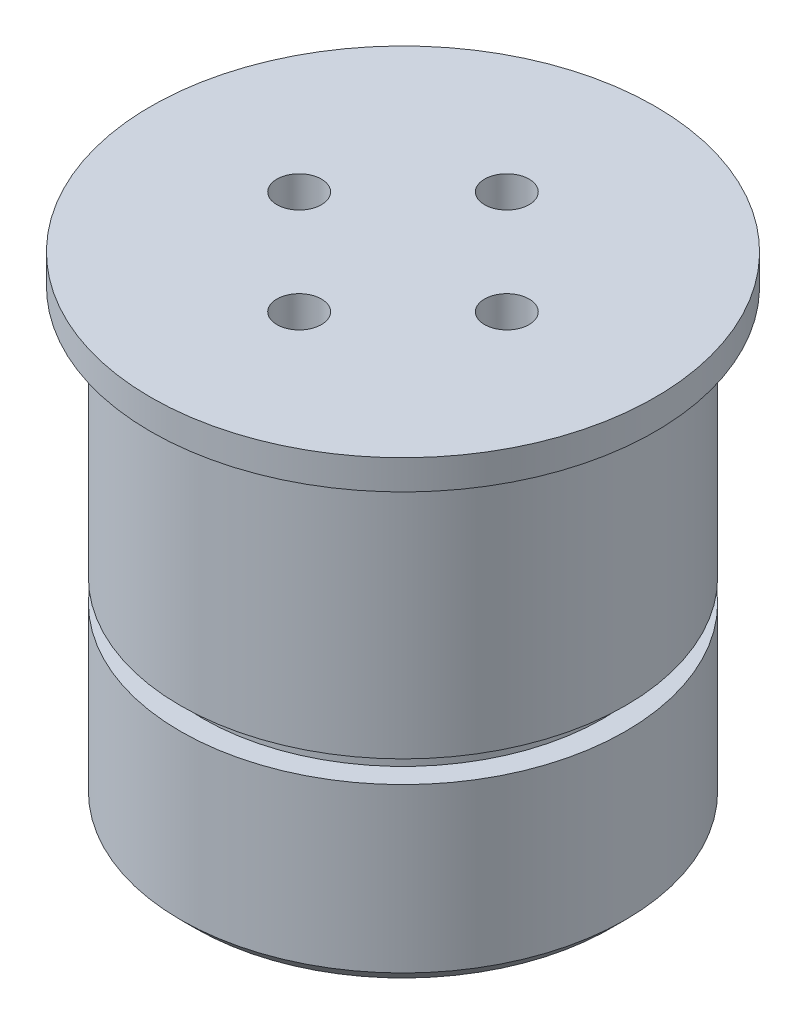
ISO-10303-21;
HEADER;
FILE_DESCRIPTION(('STEP AP214'),'2;1');
FILE_NAME('part.step','',(''),(''),'','','');
FILE_SCHEMA(('AUTOMOTIVE_DESIGN { 1 0 10303 214 1 1 1 1 }'));
ENDSEC;
DATA;
#1=APPLICATION_CONTEXT('core data for automotive mechanical design processes');
#2=APPLICATION_PROTOCOL_DEFINITION('international standard','automotive_design',2000,#1);
#3=PRODUCT_CONTEXT('',#1,'mechanical');
#4=PRODUCT('Part','Part','',(#3));
#5=PRODUCT_RELATED_PRODUCT_CATEGORY('part','',(#4));
#6=PRODUCT_DEFINITION_FORMATION('','',#4);
#7=PRODUCT_DEFINITION_CONTEXT('part definition',#1,'design');
#8=PRODUCT_DEFINITION('design','',#6,#7);
#9=PRODUCT_DEFINITION_SHAPE('','',#8);
#10=(LENGTH_UNIT() NAMED_UNIT(*) SI_UNIT(.MILLI.,.METRE.));
#11=(NAMED_UNIT(*) PLANE_ANGLE_UNIT() SI_UNIT($,.RADIAN.));
#12=(NAMED_UNIT(*) SI_UNIT($,.STERADIAN.) SOLID_ANGLE_UNIT());
#13=UNCERTAINTY_MEASURE_WITH_UNIT(LENGTH_MEASURE(1.E-05),#10,'distance_accuracy_value','');
#14=(GEOMETRIC_REPRESENTATION_CONTEXT(3) GLOBAL_UNCERTAINTY_ASSIGNED_CONTEXT((#13)) GLOBAL_UNIT_ASSIGNED_CONTEXT((#10,
#11,#12)) REPRESENTATION_CONTEXT('',''));
#15=CARTESIAN_POINT('',(0.,0.,0.));
#16=DIRECTION('',(0.,0.,1.));
#17=DIRECTION('',(1.,0.,0.));
#18=AXIS2_PLACEMENT_3D('',#15,#16,#17);
#19=CARTESIAN_POINT('',(0.,32.7031489839219,0.));
#20=DIRECTION('',(0.,1.,0.));
#21=DIRECTION('',(0.,0.,1.));
#22=AXIS2_PLACEMENT_3D('',#19,#20,#21);
#23=CYLINDRICAL_SURFACE('',#22,15.);
#24=CARTESIAN_POINT('',(0.,1.,0.));
#25=DIRECTION('',(0.,1.,0.));
#26=DIRECTION('',(0.,0.,1.));
#27=AXIS2_PLACEMENT_3D('',#24,#25,#26);
#28=CIRCLE('',#27,15.);
#29=CARTESIAN_POINT('',(0.,0.999999999999999,15.));
#30=VERTEX_POINT('',#29);
#31=EDGE_CURVE('E40',#30,#30,#28,.T.);
#32=ORIENTED_EDGE('',*,*,#31,.T.);
#33=EDGE_LOOP('',(#32));
#34=FACE_BOUND('',#33,.T.);
#35=CARTESIAN_POINT('',(0.,12.,0.));
#36=DIRECTION('',(0.,1.,0.));
#37=DIRECTION('',(0.,0.,1.));
#38=AXIS2_PLACEMENT_3D('',#35,#36,#37);
#39=CIRCLE('',#38,15.);
#40=CARTESIAN_POINT('',(0.,12.,15.));
#41=VERTEX_POINT('',#40);
#42=EDGE_CURVE('E44',#41,#41,#39,.T.);
#43=ORIENTED_EDGE('',*,*,#42,.F.);
#44=EDGE_LOOP('',(#43));
#45=FACE_BOUND('',#44,.T.);
#46=ADVANCED_FACE('F33',(#34,#45),#23,.T.);
#47=CARTESIAN_POINT('',(0.,12.,-15.));
#48=DIRECTION('',(0.,-1.,0.));
#49=DIRECTION('',(0.,0.,-1.));
#50=AXIS2_PLACEMENT_3D('',#47,#48,#49);
#51=PLANE('',#50);
#52=CARTESIAN_POINT('',(0.,12.,0.));
#53=DIRECTION('',(0.,1.,0.));
#54=DIRECTION('',(0.,0.,1.));
#55=AXIS2_PLACEMENT_3D('',#52,#53,#54);
#56=CIRCLE('',#55,13.5);
#57=CARTESIAN_POINT('',(0.,12.,13.5));
#58=VERTEX_POINT('',#57);
#59=EDGE_CURVE('E48',#58,#58,#56,.T.);
#60=ORIENTED_EDGE('',*,*,#59,.F.);
#61=EDGE_LOOP('',(#60));
#62=FACE_BOUND('',#61,.T.);
#63=ORIENTED_EDGE('',*,*,#42,.T.);
#64=EDGE_LOOP('',(#63));
#65=FACE_BOUND('',#64,.T.);
#66=ADVANCED_FACE('F125',(#62,#65),#51,.F.);
#67=CARTESIAN_POINT('',(0.,32.7031489839219,0.));
#68=DIRECTION('',(0.,1.,0.));
#69=DIRECTION('',(0.,0.,1.));
#70=AXIS2_PLACEMENT_3D('',#67,#68,#69);
#71=CYLINDRICAL_SURFACE('',#70,13.5);
#72=CARTESIAN_POINT('',(0.,13.5,0.));
#73=DIRECTION('',(0.,1.,0.));
#74=DIRECTION('',(0.,0.,1.));
#75=AXIS2_PLACEMENT_3D('',#72,#73,#74);
#76=CIRCLE('',#75,13.5);
#77=CARTESIAN_POINT('',(0.,13.5,13.5));
#78=VERTEX_POINT('',#77);
#79=EDGE_CURVE('E53',#78,#78,#76,.T.);
#80=ORIENTED_EDGE('',*,*,#79,.F.);
#81=EDGE_LOOP('',(#80));
#82=FACE_BOUND('',#81,.T.);
#83=ORIENTED_EDGE('',*,*,#59,.T.);
#84=EDGE_LOOP('',(#83));
#85=FACE_BOUND('',#84,.T.);
#86=ADVANCED_FACE('F129',(#82,#85),#71,.T.);
#87=CARTESIAN_POINT('',(0.,13.5,-13.5));
#88=DIRECTION('',(0.,1.,0.));
#89=DIRECTION('',(0.,0.,1.));
#90=AXIS2_PLACEMENT_3D('',#87,#88,#89);
#91=PLANE('',#90);
#92=CARTESIAN_POINT('',(0.,13.5,0.));
#93=DIRECTION('',(0.,1.,0.));
#94=DIRECTION('',(0.,0.,1.));
#95=AXIS2_PLACEMENT_3D('',#92,#93,#94);
#96=CIRCLE('',#95,15.);
#97=CARTESIAN_POINT('',(0.,13.5,15.));
#98=VERTEX_POINT('',#97);
#99=EDGE_CURVE('E56',#98,#98,#96,.T.);
#100=ORIENTED_EDGE('',*,*,#99,.F.);
#101=EDGE_LOOP('',(#100));
#102=FACE_BOUND('',#101,.T.);
#103=ORIENTED_EDGE('',*,*,#79,.T.);
#104=EDGE_LOOP('',(#103));
#105=FACE_BOUND('',#104,.T.);
#106=ADVANCED_FACE('F136',(#102,#105),#91,.F.);
#107=CARTESIAN_POINT('',(0.,32.7031489839219,0.));
#108=DIRECTION('',(0.,1.,0.));
#109=DIRECTION('',(0.,0.,1.));
#110=AXIS2_PLACEMENT_3D('',#107,#108,#109);
#111=CYLINDRICAL_SURFACE('',#110,15.);
#112=CARTESIAN_POINT('',(0.,30.5,0.));
#113=DIRECTION('',(0.,1.,0.));
#114=DIRECTION('',(0.,0.,1.));
#115=AXIS2_PLACEMENT_3D('',#112,#113,#114);
#116=CIRCLE('',#115,15.);
#117=CARTESIAN_POINT('',(0.,30.5,15.));
#118=VERTEX_POINT('',#117);
#119=EDGE_CURVE('E59',#118,#118,#116,.T.);
#120=ORIENTED_EDGE('',*,*,#119,.F.);
#121=EDGE_LOOP('',(#120));
#122=FACE_BOUND('',#121,.T.);
#123=ORIENTED_EDGE('',*,*,#99,.T.);
#124=EDGE_LOOP('',(#123));
#125=FACE_BOUND('',#124,.T.);
#126=ADVANCED_FACE('F140',(#122,#125),#111,.T.);
#127=CARTESIAN_POINT('',(0.,30.5,-15.));
#128=DIRECTION('',(0.,1.,0.));
#129=DIRECTION('',(0.,0.,1.));
#130=AXIS2_PLACEMENT_3D('',#127,#128,#129);
#131=PLANE('',#130);
#132=CARTESIAN_POINT('',(0.,30.5,0.));
#133=DIRECTION('',(0.,1.,0.));
#134=DIRECTION('',(0.,0.,1.));
#135=AXIS2_PLACEMENT_3D('',#132,#133,#134);
#136=CIRCLE('',#135,17.);
#137=CARTESIAN_POINT('',(0.,30.5,17.));
#138=VERTEX_POINT('',#137);
#139=EDGE_CURVE('E62',#138,#138,#136,.T.);
#140=ORIENTED_EDGE('',*,*,#139,.F.);
#141=EDGE_LOOP('',(#140));
#142=FACE_BOUND('',#141,.T.);
#143=ORIENTED_EDGE('',*,*,#119,.T.);
#144=EDGE_LOOP('',(#143));
#145=FACE_BOUND('',#144,.T.);
#146=ADVANCED_FACE('F144',(#142,#145),#131,.F.);
#147=CARTESIAN_POINT('',(0.,32.7031489839219,0.));
#148=DIRECTION('',(0.,1.,0.));
#149=DIRECTION('',(0.,0.,1.));
#150=AXIS2_PLACEMENT_3D('',#147,#148,#149);
#151=CYLINDRICAL_SURFACE('',#150,17.);
#152=CARTESIAN_POINT('',(0.,32.5,0.));
#153=DIRECTION('',(0.,1.,0.));
#154=DIRECTION('',(0.,0.,1.));
#155=AXIS2_PLACEMENT_3D('',#152,#153,#154);
#156=CIRCLE('',#155,17.);
#157=CARTESIAN_POINT('',(0.,32.5,17.));
#158=VERTEX_POINT('',#157);
#159=EDGE_CURVE('E65',#158,#158,#156,.T.);
#160=ORIENTED_EDGE('',*,*,#159,.F.);
#161=EDGE_LOOP('',(#160));
#162=FACE_BOUND('',#161,.T.);
#163=ORIENTED_EDGE('',*,*,#139,.T.);
#164=EDGE_LOOP('',(#163));
#165=FACE_BOUND('',#164,.T.);
#166=ADVANCED_FACE('F148',(#162,#165),#151,.T.);
#167=CARTESIAN_POINT('',(0.,32.5,-17.));
#168=DIRECTION('',(0.,-1.,0.));
#169=DIRECTION('',(0.,0.,-1.));
#170=AXIS2_PLACEMENT_3D('',#167,#168,#169);
#171=PLANE('',#170);
#172=CARTESIAN_POINT('',(0.,32.5,-7.));
#173=DIRECTION('',(0.,-1.,0.));
#174=DIRECTION('',(0.,0.,-1.));
#175=AXIS2_PLACEMENT_3D('',#172,#173,#174);
#176=CIRCLE('',#175,1.5);
#177=CARTESIAN_POINT('',(0.,32.5,-8.5));
#178=VERTEX_POINT('',#177);
#179=EDGE_CURVE('E80',#178,#178,#176,.F.);
#180=ORIENTED_EDGE('',*,*,#179,.F.);
#181=EDGE_LOOP('',(#180));
#182=FACE_BOUND('',#181,.T.);
#183=CARTESIAN_POINT('',(-7.,32.5,0.));
#184=DIRECTION('',(0.,-1.,0.));
#185=DIRECTION('',(0.,0.,-1.));
#186=AXIS2_PLACEMENT_3D('',#183,#184,#185);
#187=CIRCLE('',#186,1.5);
#188=CARTESIAN_POINT('',(-7.,32.5,-1.5));
#189=VERTEX_POINT('',#188);
#190=EDGE_CURVE('E88',#189,#189,#187,.F.);
#191=ORIENTED_EDGE('',*,*,#190,.F.);
#192=EDGE_LOOP('',(#191));
#193=FACE_BOUND('',#192,.T.);
#194=CARTESIAN_POINT('',(0.,32.5,7.));
#195=DIRECTION('',(0.,-1.,0.));
#196=DIRECTION('',(0.,0.,-1.));
#197=AXIS2_PLACEMENT_3D('',#194,#195,#196);
#198=CIRCLE('',#197,1.5);
#199=CARTESIAN_POINT('',(0.,32.5,5.5));
#200=VERTEX_POINT('',#199);
#201=EDGE_CURVE('E81',#200,#200,#198,.F.);
#202=ORIENTED_EDGE('',*,*,#201,.F.);
#203=EDGE_LOOP('',(#202));
#204=FACE_BOUND('',#203,.T.);
#205=CARTESIAN_POINT('',(7.,32.5,0.));
#206=DIRECTION('',(0.,-1.,0.));
#207=DIRECTION('',(0.,0.,-1.));
#208=AXIS2_PLACEMENT_3D('',#205,#206,#207);
#209=CIRCLE('',#208,1.5);
#210=CARTESIAN_POINT('',(7.,32.5,-1.5));
#211=VERTEX_POINT('',#210);
#212=EDGE_CURVE('E74',#211,#211,#209,.F.);
#213=ORIENTED_EDGE('',*,*,#212,.F.);
#214=EDGE_LOOP('',(#213));
#215=FACE_BOUND('',#214,.T.);
#216=ORIENTED_EDGE('',*,*,#159,.T.);
#217=EDGE_LOOP('',(#216));
#218=FACE_BOUND('',#217,.T.);
#219=ADVANCED_FACE('F105',(#182,#193,#204,#215,#218),#171,.F.);
#220=CARTESIAN_POINT('',(0.,2.5,-10.));
#221=DIRECTION('',(0.,1.,0.));
#222=DIRECTION('',(0.,0.,1.));
#223=AXIS2_PLACEMENT_3D('',#220,#221,#222);
#224=PLANE('',#223);
#225=CARTESIAN_POINT('',(0.,2.5,-7.));
#226=DIRECTION('',(0.,-1.,0.));
#227=DIRECTION('',(-1.,0.,0.));
#228=AXIS2_PLACEMENT_3D('',#225,#226,#227);
#229=CIRCLE('',#228,1.5);
#230=CARTESIAN_POINT('',(-1.50000000000002,2.5,-6.99999999999999));
#231=VERTEX_POINT('',#230);
#232=EDGE_CURVE('E91',#231,#231,#229,.T.);
#233=ORIENTED_EDGE('',*,*,#232,.F.);
#234=EDGE_LOOP('',(#233));
#235=FACE_BOUND('',#234,.T.);
#236=CARTESIAN_POINT('',(-7.,2.5,0.));
#237=DIRECTION('',(0.,-1.,0.));
#238=DIRECTION('',(0.,0.,1.));
#239=AXIS2_PLACEMENT_3D('',#236,#237,#238);
#240=CIRCLE('',#239,1.5);
#241=CARTESIAN_POINT('',(-7.,2.5,1.5));
#242=VERTEX_POINT('',#241);
#243=EDGE_CURVE('E84',#242,#242,#240,.T.);
#244=ORIENTED_EDGE('',*,*,#243,.F.);
#245=EDGE_LOOP('',(#244));
#246=FACE_BOUND('',#245,.T.);
#247=CARTESIAN_POINT('',(0.,2.5,7.));
#248=DIRECTION('',(0.,-1.,0.));
#249=DIRECTION('',(1.,0.,0.));
#250=AXIS2_PLACEMENT_3D('',#247,#248,#249);
#251=CIRCLE('',#250,1.5);
#252=CARTESIAN_POINT('',(1.50000000000007,2.5,6.99999999999998));
#253=VERTEX_POINT('',#252);
#254=EDGE_CURVE('E85',#253,#253,#251,.T.);
#255=ORIENTED_EDGE('',*,*,#254,.F.);
#256=EDGE_LOOP('',(#255));
#257=FACE_BOUND('',#256,.T.);
#258=CARTESIAN_POINT('',(7.,2.5,0.));
#259=DIRECTION('',(0.,-1.,0.));
#260=DIRECTION('',(0.,0.,-1.));
#261=AXIS2_PLACEMENT_3D('',#258,#259,#260);
#262=CIRCLE('',#261,1.5);
#263=CARTESIAN_POINT('',(7.,2.5,-1.5));
#264=VERTEX_POINT('',#263);
#265=EDGE_CURVE('E77',#264,#264,#262,.T.);
#266=ORIENTED_EDGE('',*,*,#265,.F.);
#267=EDGE_LOOP('',(#266));
#268=FACE_BOUND('',#267,.T.);
#269=CARTESIAN_POINT('',(0.,2.5,0.));
#270=DIRECTION('',(0.,1.,0.));
#271=DIRECTION('',(0.,0.,1.));
#272=AXIS2_PLACEMENT_3D('',#269,#270,#271);
#273=CIRCLE('',#272,10.);
#274=CARTESIAN_POINT('',(0.,2.5,10.));
#275=VERTEX_POINT('',#274);
#276=EDGE_CURVE('E68',#275,#275,#273,.T.);
#277=ORIENTED_EDGE('',*,*,#276,.F.);
#278=EDGE_LOOP('',(#277));
#279=FACE_BOUND('',#278,.T.);
#280=ADVANCED_FACE('F101',(#235,#246,#257,#268,#279),#224,.F.);
#281=CARTESIAN_POINT('',(0.,32.7031489839219,0.));
#282=DIRECTION('',(0.,1.,0.));
#283=DIRECTION('',(0.,0.,1.));
#284=AXIS2_PLACEMENT_3D('',#281,#282,#283);
#285=CYLINDRICAL_SURFACE('',#284,10.);
#286=CARTESIAN_POINT('',(0.,0.,0.));
#287=DIRECTION('',(0.,1.,0.));
#288=DIRECTION('',(0.,0.,1.));
#289=AXIS2_PLACEMENT_3D('',#286,#287,#288);
#290=CIRCLE('',#289,10.);
#291=CARTESIAN_POINT('',(0.,0.,10.));
#292=VERTEX_POINT('',#291);
#293=EDGE_CURVE('E71',#292,#292,#290,.T.);
#294=ORIENTED_EDGE('',*,*,#293,.F.);
#295=EDGE_LOOP('',(#294));
#296=FACE_BOUND('',#295,.T.);
#297=ORIENTED_EDGE('',*,*,#276,.T.);
#298=EDGE_LOOP('',(#297));
#299=FACE_BOUND('',#298,.T.);
#300=ADVANCED_FACE('F104',(#296,#299),#285,.F.);
#301=CARTESIAN_POINT('',(0.,0.,-10.));
#302=DIRECTION('',(0.,1.,0.));
#303=DIRECTION('',(0.,0.,1.));
#304=AXIS2_PLACEMENT_3D('',#301,#302,#303);
#305=PLANE('',#304);
#306=CARTESIAN_POINT('',(0.,0.,0.));
#307=DIRECTION('',(0.,1.,0.));
#308=DIRECTION('',(0.,0.,1.));
#309=AXIS2_PLACEMENT_3D('',#306,#307,#308);
#310=CIRCLE('',#309,14.);
#311=CARTESIAN_POINT('',(0.,0.,14.));
#312=VERTEX_POINT('',#311);
#313=EDGE_CURVE('E10',#312,#312,#310,.F.);
#314=ORIENTED_EDGE('',*,*,#313,.T.);
#315=EDGE_LOOP('',(#314));
#316=FACE_BOUND('',#315,.T.);
#317=ORIENTED_EDGE('',*,*,#293,.T.);
#318=EDGE_LOOP('',(#317));
#319=FACE_BOUND('',#318,.T.);
#320=ADVANCED_FACE('F116',(#316,#319),#305,.F.);
#321=CARTESIAN_POINT('',(0.,1.,0.));
#322=DIRECTION('',(0.,1.,0.));
#323=DIRECTION('',(0.,0.,1.));
#324=AXIS2_PLACEMENT_3D('',#321,#322,#323);
#325=CONICAL_SURFACE('',#324,15.,0.785398163397448);
#326=ORIENTED_EDGE('',*,*,#313,.F.);
#327=EDGE_LOOP('',(#326));
#328=FACE_BOUND('',#327,.T.);
#329=ORIENTED_EDGE('',*,*,#31,.F.);
#330=EDGE_LOOP('',(#329));
#331=FACE_BOUND('',#330,.T.);
#332=ADVANCED_FACE('F35',(#328,#331),#325,.T.);
#333=CARTESIAN_POINT('',(7.,36.7426406871193,0.));
#334=DIRECTION('',(0.,-1.,0.));
#335=DIRECTION('',(0.,0.,-1.));
#336=AXIS2_PLACEMENT_3D('',#333,#334,#335);
#337=CYLINDRICAL_SURFACE('',#336,1.5);
#338=ORIENTED_EDGE('',*,*,#212,.T.);
#339=EDGE_LOOP('',(#338));
#340=FACE_BOUND('',#339,.T.);
#341=ORIENTED_EDGE('',*,*,#265,.T.);
#342=EDGE_LOOP('',(#341));
#343=FACE_BOUND('',#342,.T.);
#344=ADVANCED_FACE('F179',(#340,#343),#337,.F.);
#345=CARTESIAN_POINT('',(0.,36.7426406871193,7.));
#346=DIRECTION('',(0.,-1.,0.));
#347=DIRECTION('',(0.,0.,-1.));
#348=AXIS2_PLACEMENT_3D('',#345,#346,#347);
#349=CYLINDRICAL_SURFACE('',#348,1.5);
#350=ORIENTED_EDGE('',*,*,#201,.T.);
#351=EDGE_LOOP('',(#350));
#352=FACE_BOUND('',#351,.T.);
#353=ORIENTED_EDGE('',*,*,#254,.T.);
#354=EDGE_LOOP('',(#353));
#355=FACE_BOUND('',#354,.T.);
#356=ADVANCED_FACE('F182',(#352,#355),#349,.F.);
#357=CARTESIAN_POINT('',(-7.,36.7426406871193,0.));
#358=DIRECTION('',(0.,-1.,0.));
#359=DIRECTION('',(0.,0.,-1.));
#360=AXIS2_PLACEMENT_3D('',#357,#358,#359);
#361=CYLINDRICAL_SURFACE('',#360,1.5);
#362=ORIENTED_EDGE('',*,*,#190,.T.);
#363=EDGE_LOOP('',(#362));
#364=FACE_BOUND('',#363,.T.);
#365=ORIENTED_EDGE('',*,*,#243,.T.);
#366=EDGE_LOOP('',(#365));
#367=FACE_BOUND('',#366,.T.);
#368=ADVANCED_FACE('F188',(#364,#367),#361,.F.);
#369=CARTESIAN_POINT('',(0.,36.7426406871193,-7.));
#370=DIRECTION('',(0.,-1.,0.));
#371=DIRECTION('',(0.,0.,-1.));
#372=AXIS2_PLACEMENT_3D('',#369,#370,#371);
#373=CYLINDRICAL_SURFACE('',#372,1.5);
#374=ORIENTED_EDGE('',*,*,#179,.T.);
#375=EDGE_LOOP('',(#374));
#376=FACE_BOUND('',#375,.T.);
#377=ORIENTED_EDGE('',*,*,#232,.T.);
#378=EDGE_LOOP('',(#377));
#379=FACE_BOUND('',#378,.T.);
#380=ADVANCED_FACE('F99',(#376,#379),#373,.F.);
#381=CLOSED_SHELL('',(#46,#66,#86,#106,#126,#146,#166,#219,#280,#300,#320,#332,#344,#356,#368,#380));
#382=MANIFOLD_SOLID_BREP('B2',#381);
#383=ADVANCED_BREP_SHAPE_REPRESENTATION('',(#18,#382),#14);
#384=SHAPE_DEFINITION_REPRESENTATION(#9,#383);
ENDSEC;
END-ISO-10303-21;
